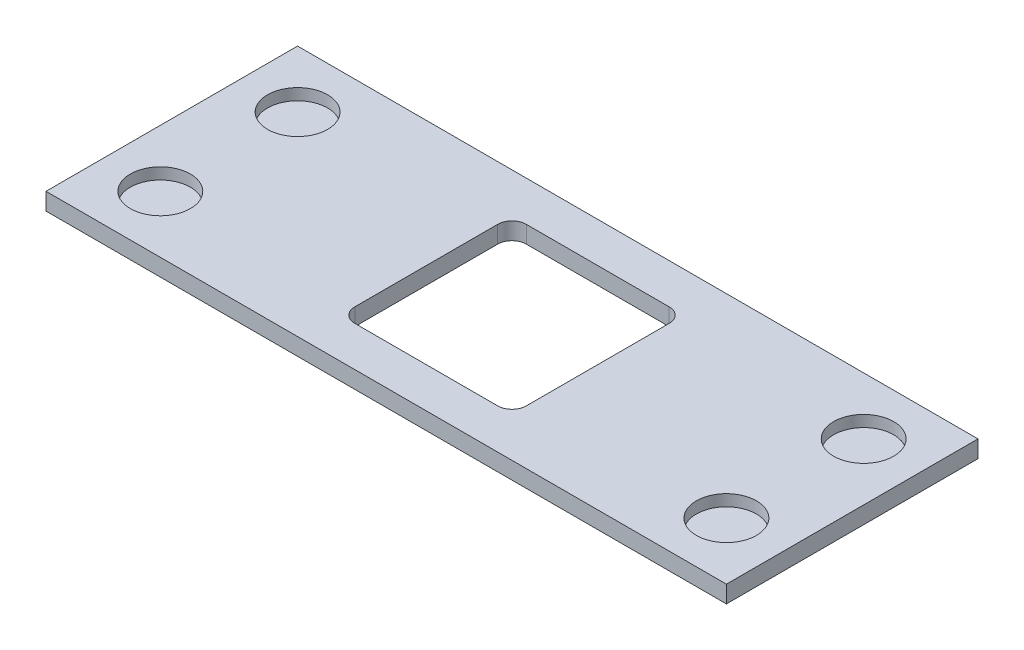
ISO-10303-21;
HEADER;
FILE_DESCRIPTION(('STEP AP214'),'2;1');
FILE_NAME('part.step','',(''),(''),'','','');
FILE_SCHEMA(('AUTOMOTIVE_DESIGN { 1 0 10303 214 1 1 1 1 }'));
ENDSEC;
DATA;
#1=APPLICATION_CONTEXT('core data for automotive mechanical design processes');
#2=APPLICATION_PROTOCOL_DEFINITION('international standard','automotive_design',2000,#1);
#3=PRODUCT_CONTEXT('',#1,'mechanical');
#4=PRODUCT('Part','Part','',(#3));
#5=PRODUCT_RELATED_PRODUCT_CATEGORY('part','',(#4));
#6=PRODUCT_DEFINITION_FORMATION('','',#4);
#7=PRODUCT_DEFINITION_CONTEXT('part definition',#1,'design');
#8=PRODUCT_DEFINITION('design','',#6,#7);
#9=PRODUCT_DEFINITION_SHAPE('','',#8);
#10=(LENGTH_UNIT() NAMED_UNIT(*) SI_UNIT(.MILLI.,.METRE.));
#11=(NAMED_UNIT(*) PLANE_ANGLE_UNIT() SI_UNIT($,.RADIAN.));
#12=(NAMED_UNIT(*) SI_UNIT($,.STERADIAN.) SOLID_ANGLE_UNIT());
#13=UNCERTAINTY_MEASURE_WITH_UNIT(LENGTH_MEASURE(1.E-05),#10,'distance_accuracy_value','');
#14=(GEOMETRIC_REPRESENTATION_CONTEXT(3) GLOBAL_UNCERTAINTY_ASSIGNED_CONTEXT((#13)) GLOBAL_UNIT_ASSIGNED_CONTEXT((#10,
#11,#12)) REPRESENTATION_CONTEXT('',''));
#15=CARTESIAN_POINT('',(0.,0.,0.));
#16=DIRECTION('',(0.,0.,1.));
#17=DIRECTION('',(1.,0.,0.));
#18=AXIS2_PLACEMENT_3D('',#15,#16,#17);
#19=CARTESIAN_POINT('',(59.5,3.,22.));
#20=DIRECTION('',(0.,1.,0.));
#21=DIRECTION('',(0.,0.,1.));
#22=AXIS2_PLACEMENT_3D('',#19,#20,#21);
#23=PLANE('',#22);
#24=CARTESIAN_POINT('',(-12.5,3.,-12.5));
#25=DIRECTION('',(0.,1.,0.));
#26=DIRECTION('',(0.,0.,1.));
#27=AXIS2_PLACEMENT_3D('',#24,#25,#26);
#28=CIRCLE('',#27,2.5);
#29=CARTESIAN_POINT('',(-12.5,3.,-15.));
#30=VERTEX_POINT('',#29);
#31=CARTESIAN_POINT('',(-15.,3.,-12.5));
#32=VERTEX_POINT('',#31);
#33=EDGE_CURVE('E49',#30,#32,#28,.T.);
#34=ORIENTED_EDGE('',*,*,#33,.F.);
#35=DIRECTION('',(-1.,0.,0.));
#36=VECTOR('',#35,1.);
#37=CARTESIAN_POINT('',(-12.5,3.,-15.));
#38=LINE('',#37,#36);
#39=CARTESIAN_POINT('',(12.5,3.,-15.));
#40=VERTEX_POINT('',#39);
#41=EDGE_CURVE('E142',#40,#30,#38,.T.);
#42=ORIENTED_EDGE('',*,*,#41,.F.);
#43=CARTESIAN_POINT('',(12.5,3.,-12.5));
#44=DIRECTION('',(0.,1.,0.));
#45=DIRECTION('',(0.,0.,-1.));
#46=AXIS2_PLACEMENT_3D('',#43,#44,#45);
#47=CIRCLE('',#46,2.5);
#48=CARTESIAN_POINT('',(15.,3.,-12.5));
#49=VERTEX_POINT('',#48);
#50=EDGE_CURVE('E145',#49,#40,#47,.T.);
#51=ORIENTED_EDGE('',*,*,#50,.F.);
#52=DIRECTION('',(0.,0.,-1.));
#53=VECTOR('',#52,1.);
#54=CARTESIAN_POINT('',(15.,3.,-12.5));
#55=LINE('',#54,#53);
#56=CARTESIAN_POINT('',(15.,3.,12.5));
#57=VERTEX_POINT('',#56);
#58=EDGE_CURVE('E173',#57,#49,#55,.T.);
#59=ORIENTED_EDGE('',*,*,#58,.F.);
#60=CARTESIAN_POINT('',(12.5,3.,12.5));
#61=DIRECTION('',(0.,1.,0.));
#62=DIRECTION('',(0.,0.,1.));
#63=AXIS2_PLACEMENT_3D('',#60,#61,#62);
#64=CIRCLE('',#63,2.5);
#65=CARTESIAN_POINT('',(12.5,3.,15.));
#66=VERTEX_POINT('',#65);
#67=EDGE_CURVE('E170',#66,#57,#64,.T.);
#68=ORIENTED_EDGE('',*,*,#67,.F.);
#69=DIRECTION('',(1.,0.,0.));
#70=VECTOR('',#69,1.);
#71=CARTESIAN_POINT('',(-12.5,3.,15.));
#72=LINE('',#71,#70);
#73=CARTESIAN_POINT('',(-12.5,3.,15.));
#74=VERTEX_POINT('',#73);
#75=EDGE_CURVE('E167',#74,#66,#72,.T.);
#76=ORIENTED_EDGE('',*,*,#75,.F.);
#77=CARTESIAN_POINT('',(-12.5,3.,12.5));
#78=DIRECTION('',(0.,1.,0.));
#79=DIRECTION('',(0.,0.,1.));
#80=AXIS2_PLACEMENT_3D('',#77,#78,#79);
#81=CIRCLE('',#80,2.5);
#82=CARTESIAN_POINT('',(-15.,3.,12.5));
#83=VERTEX_POINT('',#82);
#84=EDGE_CURVE('E164',#83,#74,#81,.T.);
#85=ORIENTED_EDGE('',*,*,#84,.F.);
#86=DIRECTION('',(0.,0.,1.));
#87=VECTOR('',#86,1.);
#88=CARTESIAN_POINT('',(-15.,3.,-12.5));
#89=LINE('',#88,#87);
#90=EDGE_CURVE('E162',#32,#83,#89,.T.);
#91=ORIENTED_EDGE('',*,*,#90,.F.);
#92=EDGE_LOOP('',(#34,#42,#51,#59,#68,#76,#85,#91));
#93=FACE_BOUND('',#92,.T.);
#94=CARTESIAN_POINT('',(49.5,3.,-12.));
#95=DIRECTION('',(0.,-1.,0.));
#96=DIRECTION('',(0.,0.,1.));
#97=AXIS2_PLACEMENT_3D('',#94,#95,#96);
#98=CIRCLE('',#97,5.25);
#99=CARTESIAN_POINT('',(49.5,3.,-6.74999999999999));
#100=VERTEX_POINT('',#99);
#101=EDGE_CURVE('E201',#100,#100,#98,.T.);
#102=ORIENTED_EDGE('',*,*,#101,.T.);
#103=EDGE_LOOP('',(#102));
#104=FACE_BOUND('',#103,.T.);
#105=CARTESIAN_POINT('',(-49.5,3.,-12.));
#106=DIRECTION('',(0.,1.,0.));
#107=DIRECTION('',(0.,0.,1.));
#108=AXIS2_PLACEMENT_3D('',#105,#106,#107);
#109=CIRCLE('',#108,5.25);
#110=CARTESIAN_POINT('',(-49.5,3.,-6.74999999999999));
#111=VERTEX_POINT('',#110);
#112=EDGE_CURVE('E207',#111,#111,#109,.T.);
#113=ORIENTED_EDGE('',*,*,#112,.F.);
#114=EDGE_LOOP('',(#113));
#115=FACE_BOUND('',#114,.T.);
#116=DIRECTION('',(0.,0.,-1.));
#117=VECTOR('',#116,1.);
#118=CARTESIAN_POINT('',(59.5,3.,-22.));
#119=LINE('',#118,#117);
#120=CARTESIAN_POINT('',(59.5,3.,22.));
#121=VERTEX_POINT('',#120);
#122=CARTESIAN_POINT('',(59.5,3.,-22.));
#123=VERTEX_POINT('',#122);
#124=EDGE_CURVE('E216',#121,#123,#119,.T.);
#125=ORIENTED_EDGE('',*,*,#124,.T.);
#126=DIRECTION('',(-1.,0.,0.));
#127=VECTOR('',#126,1.);
#128=CARTESIAN_POINT('',(-59.5,3.,-22.));
#129=LINE('',#128,#127);
#130=CARTESIAN_POINT('',(-59.5,3.,-22.));
#131=VERTEX_POINT('',#130);
#132=EDGE_CURVE('E219',#123,#131,#129,.T.);
#133=ORIENTED_EDGE('',*,*,#132,.T.);
#134=DIRECTION('',(0.,0.,1.));
#135=VECTOR('',#134,1.);
#136=CARTESIAN_POINT('',(-59.5,3.,-22.));
#137=LINE('',#136,#135);
#138=CARTESIAN_POINT('',(-59.5,3.,22.));
#139=VERTEX_POINT('',#138);
#140=EDGE_CURVE('E222',#131,#139,#137,.T.);
#141=ORIENTED_EDGE('',*,*,#140,.T.);
#142=DIRECTION('',(1.,0.,0.));
#143=VECTOR('',#142,1.);
#144=CARTESIAN_POINT('',(-59.5,3.,22.));
#145=LINE('',#144,#143);
#146=EDGE_CURVE('E224',#139,#121,#145,.T.);
#147=ORIENTED_EDGE('',*,*,#146,.T.);
#148=EDGE_LOOP('',(#125,#133,#141,#147));
#149=FACE_BOUND('',#148,.T.);
#150=CARTESIAN_POINT('',(49.5,3.,12.));
#151=DIRECTION('',(0.,1.,0.));
#152=DIRECTION('',(0.,0.,-1.));
#153=AXIS2_PLACEMENT_3D('',#150,#151,#152);
#154=CIRCLE('',#153,5.25);
#155=CARTESIAN_POINT('',(49.5,3.,6.74999999999999));
#156=VERTEX_POINT('',#155);
#157=EDGE_CURVE('E195',#156,#156,#154,.T.);
#158=ORIENTED_EDGE('',*,*,#157,.F.);
#159=EDGE_LOOP('',(#158));
#160=FACE_BOUND('',#159,.T.);
#161=CARTESIAN_POINT('',(-49.5,3.,12.));
#162=DIRECTION('',(0.,-1.,0.));
#163=DIRECTION('',(0.,0.,-1.));
#164=AXIS2_PLACEMENT_3D('',#161,#162,#163);
#165=CIRCLE('',#164,5.25);
#166=CARTESIAN_POINT('',(-49.5,3.,6.74999999999999));
#167=VERTEX_POINT('',#166);
#168=EDGE_CURVE('E180',#167,#167,#165,.T.);
#169=ORIENTED_EDGE('',*,*,#168,.T.);
#170=EDGE_LOOP('',(#169));
#171=FACE_BOUND('',#170,.T.);
#172=ADVANCED_FACE('F34',(#93,#104,#115,#149,#160,#171),#23,.T.);
#173=CARTESIAN_POINT('',(59.5,3.,-22.));
#174=DIRECTION('',(-1.,0.,0.));
#175=DIRECTION('',(0.,0.,1.));
#176=AXIS2_PLACEMENT_3D('',#173,#174,#175);
#177=PLANE('',#176);
#178=DIRECTION('',(0.,0.,-1.));
#179=VECTOR('',#178,1.);
#180=CARTESIAN_POINT('',(59.5,0.,-22.));
#181=LINE('',#180,#179);
#182=CARTESIAN_POINT('',(59.5,0.,22.));
#183=VERTEX_POINT('',#182);
#184=CARTESIAN_POINT('',(59.5,0.,-22.));
#185=VERTEX_POINT('',#184);
#186=EDGE_CURVE('E213',#183,#185,#181,.T.);
#187=ORIENTED_EDGE('',*,*,#186,.T.);
#188=DIRECTION('',(0.,-1.,0.));
#189=VECTOR('',#188,1.);
#190=CARTESIAN_POINT('',(59.5,3.,-22.));
#191=LINE('',#190,#189);
#192=EDGE_CURVE('E11',#123,#185,#191,.T.);
#193=ORIENTED_EDGE('',*,*,#192,.F.);
#194=ORIENTED_EDGE('',*,*,#124,.F.);
#195=DIRECTION('',(0.,-1.,0.));
#196=VECTOR('',#195,1.);
#197=CARTESIAN_POINT('',(59.5,3.,22.));
#198=LINE('',#197,#196);
#199=EDGE_CURVE('E226',#121,#183,#198,.T.);
#200=ORIENTED_EDGE('',*,*,#199,.T.);
#201=EDGE_LOOP('',(#187,#193,#194,#200));
#202=FACE_BOUND('',#201,.T.);
#203=ADVANCED_FACE('F36',(#202),#177,.F.);
#204=CARTESIAN_POINT('',(-59.5,3.,-22.));
#205=DIRECTION('',(0.,0.,1.));
#206=DIRECTION('',(1.,0.,0.));
#207=AXIS2_PLACEMENT_3D('',#204,#205,#206);
#208=PLANE('',#207);
#209=DIRECTION('',(-1.,0.,0.));
#210=VECTOR('',#209,1.);
#211=CARTESIAN_POINT('',(-59.5,0.,-22.));
#212=LINE('',#211,#210);
#213=CARTESIAN_POINT('',(-59.5,0.,-22.));
#214=VERTEX_POINT('',#213);
#215=EDGE_CURVE('E229',#185,#214,#212,.T.);
#216=ORIENTED_EDGE('',*,*,#215,.T.);
#217=DIRECTION('',(0.,-1.,0.));
#218=VECTOR('',#217,1.);
#219=CARTESIAN_POINT('',(-59.5,3.,-22.));
#220=LINE('',#219,#218);
#221=EDGE_CURVE('E42',#131,#214,#220,.T.);
#222=ORIENTED_EDGE('',*,*,#221,.F.);
#223=ORIENTED_EDGE('',*,*,#132,.F.);
#224=ORIENTED_EDGE('',*,*,#192,.T.);
#225=EDGE_LOOP('',(#216,#222,#223,#224));
#226=FACE_BOUND('',#225,.T.);
#227=ADVANCED_FACE('F257',(#226),#208,.F.);
#228=CARTESIAN_POINT('',(-59.5,3.,-22.));
#229=DIRECTION('',(1.,0.,0.));
#230=DIRECTION('',(0.,0.,-1.));
#231=AXIS2_PLACEMENT_3D('',#228,#229,#230);
#232=PLANE('',#231);
#233=DIRECTION('',(0.,0.,1.));
#234=VECTOR('',#233,1.);
#235=CARTESIAN_POINT('',(-59.5,0.,-22.));
#236=LINE('',#235,#234);
#237=CARTESIAN_POINT('',(-59.5,0.,22.));
#238=VERTEX_POINT('',#237);
#239=EDGE_CURVE('E231',#214,#238,#236,.T.);
#240=ORIENTED_EDGE('',*,*,#239,.T.);
#241=DIRECTION('',(0.,-1.,0.));
#242=VECTOR('',#241,1.);
#243=CARTESIAN_POINT('',(-59.5,3.,22.));
#244=LINE('',#243,#242);
#245=EDGE_CURVE('E236',#139,#238,#244,.T.);
#246=ORIENTED_EDGE('',*,*,#245,.F.);
#247=ORIENTED_EDGE('',*,*,#140,.F.);
#248=ORIENTED_EDGE('',*,*,#221,.T.);
#249=EDGE_LOOP('',(#240,#246,#247,#248));
#250=FACE_BOUND('',#249,.T.);
#251=ADVANCED_FACE('F243',(#250),#232,.F.);
#252=CARTESIAN_POINT('',(-59.5,3.,22.));
#253=DIRECTION('',(0.,0.,-1.));
#254=DIRECTION('',(-1.,0.,0.));
#255=AXIS2_PLACEMENT_3D('',#252,#253,#254);
#256=PLANE('',#255);
#257=DIRECTION('',(1.,0.,0.));
#258=VECTOR('',#257,1.);
#259=CARTESIAN_POINT('',(-59.5,0.,22.));
#260=LINE('',#259,#258);
#261=EDGE_CURVE('E220',#238,#183,#260,.T.);
#262=ORIENTED_EDGE('',*,*,#261,.T.);
#263=ORIENTED_EDGE('',*,*,#199,.F.);
#264=ORIENTED_EDGE('',*,*,#146,.F.);
#265=ORIENTED_EDGE('',*,*,#245,.T.);
#266=EDGE_LOOP('',(#262,#263,#264,#265));
#267=FACE_BOUND('',#266,.T.);
#268=ADVANCED_FACE('F250',(#267),#256,.F.);
#269=CARTESIAN_POINT('',(59.5,0.,22.));
#270=DIRECTION('',(0.,1.,0.));
#271=DIRECTION('',(0.,0.,1.));
#272=AXIS2_PLACEMENT_3D('',#269,#270,#271);
#273=PLANE('',#272);
#274=DIRECTION('',(-1.,0.,0.));
#275=VECTOR('',#274,1.);
#276=CARTESIAN_POINT('',(-12.5,0.,-15.));
#277=LINE('',#276,#275);
#278=CARTESIAN_POINT('',(12.5,0.,-15.));
#279=VERTEX_POINT('',#278);
#280=CARTESIAN_POINT('',(-12.5,0.,-15.));
#281=VERTEX_POINT('',#280);
#282=EDGE_CURVE('E131',#279,#281,#277,.T.);
#283=ORIENTED_EDGE('',*,*,#282,.T.);
#284=CARTESIAN_POINT('',(-12.5,0.,-12.5));
#285=DIRECTION('',(0.,1.,0.));
#286=DIRECTION('',(0.,0.,1.));
#287=AXIS2_PLACEMENT_3D('',#284,#285,#286);
#288=CIRCLE('',#287,2.5);
#289=CARTESIAN_POINT('',(-15.,0.,-12.5));
#290=VERTEX_POINT('',#289);
#291=EDGE_CURVE('E125',#281,#290,#288,.T.);
#292=ORIENTED_EDGE('',*,*,#291,.T.);
#293=DIRECTION('',(0.,0.,1.));
#294=VECTOR('',#293,1.);
#295=CARTESIAN_POINT('',(-15.,0.,-12.5));
#296=LINE('',#295,#294);
#297=CARTESIAN_POINT('',(-15.,0.,12.5));
#298=VERTEX_POINT('',#297);
#299=EDGE_CURVE('E134',#290,#298,#296,.T.);
#300=ORIENTED_EDGE('',*,*,#299,.T.);
#301=CARTESIAN_POINT('',(-12.5,0.,12.5));
#302=DIRECTION('',(0.,1.,0.));
#303=DIRECTION('',(0.,0.,1.));
#304=AXIS2_PLACEMENT_3D('',#301,#302,#303);
#305=CIRCLE('',#304,2.5);
#306=CARTESIAN_POINT('',(-12.5,0.,15.));
#307=VERTEX_POINT('',#306);
#308=EDGE_CURVE('E57',#298,#307,#305,.T.);
#309=ORIENTED_EDGE('',*,*,#308,.T.);
#310=DIRECTION('',(1.,0.,0.));
#311=VECTOR('',#310,1.);
#312=CARTESIAN_POINT('',(-12.5,0.,15.));
#313=LINE('',#312,#311);
#314=CARTESIAN_POINT('',(12.5,0.,15.));
#315=VERTEX_POINT('',#314);
#316=EDGE_CURVE('E149',#307,#315,#313,.T.);
#317=ORIENTED_EDGE('',*,*,#316,.T.);
#318=CARTESIAN_POINT('',(12.5,0.,12.5));
#319=DIRECTION('',(0.,1.,0.));
#320=DIRECTION('',(0.,0.,1.));
#321=AXIS2_PLACEMENT_3D('',#318,#319,#320);
#322=CIRCLE('',#321,2.5);
#323=CARTESIAN_POINT('',(15.,0.,12.5));
#324=VERTEX_POINT('',#323);
#325=EDGE_CURVE('E152',#315,#324,#322,.T.);
#326=ORIENTED_EDGE('',*,*,#325,.T.);
#327=DIRECTION('',(0.,0.,-1.));
#328=VECTOR('',#327,1.);
#329=CARTESIAN_POINT('',(15.,0.,-12.5));
#330=LINE('',#329,#328);
#331=CARTESIAN_POINT('',(15.,0.,-12.5));
#332=VERTEX_POINT('',#331);
#333=EDGE_CURVE('E155',#324,#332,#330,.T.);
#334=ORIENTED_EDGE('',*,*,#333,.T.);
#335=CARTESIAN_POINT('',(12.5,0.,-12.5));
#336=DIRECTION('',(0.,1.,0.));
#337=DIRECTION('',(0.,0.,-1.));
#338=AXIS2_PLACEMENT_3D('',#335,#336,#337);
#339=CIRCLE('',#338,2.5);
#340=EDGE_CURVE('E158',#332,#279,#339,.T.);
#341=ORIENTED_EDGE('',*,*,#340,.T.);
#342=EDGE_LOOP('',(#283,#292,#300,#309,#317,#326,#334,#341));
#343=FACE_BOUND('',#342,.T.);
#344=ORIENTED_EDGE('',*,*,#186,.F.);
#345=ORIENTED_EDGE('',*,*,#261,.F.);
#346=ORIENTED_EDGE('',*,*,#239,.F.);
#347=ORIENTED_EDGE('',*,*,#215,.F.);
#348=EDGE_LOOP('',(#344,#345,#346,#347));
#349=FACE_BOUND('',#348,.T.);
#350=ADVANCED_FACE('F138',(#343,#349),#273,.F.);
#351=CARTESIAN_POINT('',(-49.5,1.,-12.));
#352=DIRECTION('',(0.,1.,0.));
#353=DIRECTION('',(0.,0.,1.));
#354=AXIS2_PLACEMENT_3D('',#351,#352,#353);
#355=CYLINDRICAL_SURFACE('',#354,5.25);
#356=CARTESIAN_POINT('',(-49.5,1.,-12.));
#357=DIRECTION('',(0.,1.,0.));
#358=DIRECTION('',(0.,0.,1.));
#359=AXIS2_PLACEMENT_3D('',#356,#357,#358);
#360=CIRCLE('',#359,5.25);
#361=CARTESIAN_POINT('',(-49.5,1.,-6.74999999999999));
#362=VERTEX_POINT('',#361);
#363=EDGE_CURVE('E210',#362,#362,#360,.T.);
#364=ORIENTED_EDGE('',*,*,#363,.F.);
#365=EDGE_LOOP('',(#364));
#366=FACE_BOUND('',#365,.T.);
#367=ORIENTED_EDGE('',*,*,#112,.T.);
#368=EDGE_LOOP('',(#367));
#369=FACE_BOUND('',#368,.T.);
#370=ADVANCED_FACE('F272',(#366,#369),#355,.F.);
#371=CARTESIAN_POINT('',(-49.5,1.,-12.));
#372=DIRECTION('',(0.,1.,0.));
#373=DIRECTION('',(0.,0.,1.));
#374=AXIS2_PLACEMENT_3D('',#371,#372,#373);
#375=PLANE('',#374);
#376=ORIENTED_EDGE('',*,*,#363,.T.);
#377=EDGE_LOOP('',(#376));
#378=FACE_BOUND('',#377,.T.);
#379=ADVANCED_FACE('F292',(#378),#375,.T.);
#380=CARTESIAN_POINT('',(49.5,1.,-12.));
#381=DIRECTION('',(0.,1.,0.));
#382=DIRECTION('',(0.,0.,1.));
#383=AXIS2_PLACEMENT_3D('',#380,#381,#382);
#384=CYLINDRICAL_SURFACE('',#383,5.25);
#385=CARTESIAN_POINT('',(49.5,1.,-12.));
#386=DIRECTION('',(0.,-1.,0.));
#387=DIRECTION('',(0.,0.,1.));
#388=AXIS2_PLACEMENT_3D('',#385,#386,#387);
#389=CIRCLE('',#388,5.25);
#390=CARTESIAN_POINT('',(49.5,1.,-6.74999999999999));
#391=VERTEX_POINT('',#390);
#392=EDGE_CURVE('E204',#391,#391,#389,.T.);
#393=ORIENTED_EDGE('',*,*,#392,.T.);
#394=EDGE_LOOP('',(#393));
#395=FACE_BOUND('',#394,.T.);
#396=ORIENTED_EDGE('',*,*,#101,.F.);
#397=EDGE_LOOP('',(#396));
#398=FACE_BOUND('',#397,.T.);
#399=ADVANCED_FACE('F299',(#395,#398),#384,.F.);
#400=CARTESIAN_POINT('',(49.5,1.,-12.));
#401=DIRECTION('',(0.,1.,0.));
#402=DIRECTION('',(0.,0.,1.));
#403=AXIS2_PLACEMENT_3D('',#400,#401,#402);
#404=PLANE('',#403);
#405=ORIENTED_EDGE('',*,*,#392,.F.);
#406=EDGE_LOOP('',(#405));
#407=FACE_BOUND('',#406,.T.);
#408=ADVANCED_FACE('F306',(#407),#404,.T.);
#409=CARTESIAN_POINT('',(49.5,1.,12.));
#410=DIRECTION('',(0.,1.,0.));
#411=DIRECTION('',(0.,0.,1.));
#412=AXIS2_PLACEMENT_3D('',#409,#410,#411);
#413=CYLINDRICAL_SURFACE('',#412,5.25);
#414=CARTESIAN_POINT('',(49.5,1.,12.));
#415=DIRECTION('',(0.,1.,0.));
#416=DIRECTION('',(0.,0.,-1.));
#417=AXIS2_PLACEMENT_3D('',#414,#415,#416);
#418=CIRCLE('',#417,5.25);
#419=CARTESIAN_POINT('',(49.5,1.,6.74999999999999));
#420=VERTEX_POINT('',#419);
#421=EDGE_CURVE('E198',#420,#420,#418,.T.);
#422=ORIENTED_EDGE('',*,*,#421,.F.);
#423=EDGE_LOOP('',(#422));
#424=FACE_BOUND('',#423,.T.);
#425=ORIENTED_EDGE('',*,*,#157,.T.);
#426=EDGE_LOOP('',(#425));
#427=FACE_BOUND('',#426,.T.);
#428=ADVANCED_FACE('F314',(#424,#427),#413,.F.);
#429=CARTESIAN_POINT('',(49.5,1.,12.));
#430=DIRECTION('',(0.,1.,0.));
#431=DIRECTION('',(0.,0.,-1.));
#432=AXIS2_PLACEMENT_3D('',#429,#430,#431);
#433=PLANE('',#432);
#434=ORIENTED_EDGE('',*,*,#421,.T.);
#435=EDGE_LOOP('',(#434));
#436=FACE_BOUND('',#435,.T.);
#437=ADVANCED_FACE('F322',(#436),#433,.T.);
#438=CARTESIAN_POINT('',(-49.5,1.,12.));
#439=DIRECTION('',(0.,1.,0.));
#440=DIRECTION('',(0.,0.,1.));
#441=AXIS2_PLACEMENT_3D('',#438,#439,#440);
#442=CYLINDRICAL_SURFACE('',#441,5.25);
#443=CARTESIAN_POINT('',(-49.5,1.,12.));
#444=DIRECTION('',(0.,-1.,0.));
#445=DIRECTION('',(0.,0.,-1.));
#446=AXIS2_PLACEMENT_3D('',#443,#444,#445);
#447=CIRCLE('',#446,5.25);
#448=CARTESIAN_POINT('',(-49.5,1.,6.74999999999999));
#449=VERTEX_POINT('',#448);
#450=EDGE_CURVE('E192',#449,#449,#447,.T.);
#451=ORIENTED_EDGE('',*,*,#450,.T.);
#452=EDGE_LOOP('',(#451));
#453=FACE_BOUND('',#452,.T.);
#454=ORIENTED_EDGE('',*,*,#168,.F.);
#455=EDGE_LOOP('',(#454));
#456=FACE_BOUND('',#455,.T.);
#457=ADVANCED_FACE('F330',(#453,#456),#442,.F.);
#458=CARTESIAN_POINT('',(-49.5,1.,12.));
#459=DIRECTION('',(0.,1.,0.));
#460=DIRECTION('',(0.,0.,-1.));
#461=AXIS2_PLACEMENT_3D('',#458,#459,#460);
#462=PLANE('',#461);
#463=ORIENTED_EDGE('',*,*,#450,.F.);
#464=EDGE_LOOP('',(#463));
#465=FACE_BOUND('',#464,.T.);
#466=ADVANCED_FACE('F338',(#465),#462,.T.);
#467=CARTESIAN_POINT('',(-12.5,0.,-12.5));
#468=DIRECTION('',(0.,1.,0.));
#469=DIRECTION('',(0.,0.,1.));
#470=AXIS2_PLACEMENT_3D('',#467,#468,#469);
#471=CYLINDRICAL_SURFACE('',#470,2.5);
#472=ORIENTED_EDGE('',*,*,#33,.T.);
#473=DIRECTION('',(0.,1.,0.));
#474=VECTOR('',#473,1.);
#475=CARTESIAN_POINT('',(-15.,0.,-12.5));
#476=LINE('',#475,#474);
#477=EDGE_CURVE('E121',#290,#32,#476,.T.);
#478=ORIENTED_EDGE('',*,*,#477,.F.);
#479=ORIENTED_EDGE('',*,*,#291,.F.);
#480=DIRECTION('',(0.,1.,0.));
#481=VECTOR('',#480,1.);
#482=CARTESIAN_POINT('',(-12.5,0.,-15.));
#483=LINE('',#482,#481);
#484=EDGE_CURVE('E178',#281,#30,#483,.T.);
#485=ORIENTED_EDGE('',*,*,#484,.T.);
#486=EDGE_LOOP('',(#472,#478,#479,#485));
#487=FACE_BOUND('',#486,.T.);
#488=ADVANCED_FACE('F123',(#487),#471,.F.);
#489=CARTESIAN_POINT('',(-12.5,0.,-15.));
#490=DIRECTION('',(0.,0.,-1.));
#491=DIRECTION('',(-1.,0.,0.));
#492=AXIS2_PLACEMENT_3D('',#489,#490,#491);
#493=PLANE('',#492);
#494=ORIENTED_EDGE('',*,*,#41,.T.);
#495=ORIENTED_EDGE('',*,*,#484,.F.);
#496=ORIENTED_EDGE('',*,*,#282,.F.);
#497=DIRECTION('',(0.,1.,0.));
#498=VECTOR('',#497,1.);
#499=CARTESIAN_POINT('',(12.5,0.,-15.));
#500=LINE('',#499,#498);
#501=EDGE_CURVE('E181',#279,#40,#500,.T.);
#502=ORIENTED_EDGE('',*,*,#501,.T.);
#503=EDGE_LOOP('',(#494,#495,#496,#502));
#504=FACE_BOUND('',#503,.T.);
#505=ADVANCED_FACE('F352',(#504),#493,.F.);
#506=CARTESIAN_POINT('',(12.5,0.,-12.5));
#507=DIRECTION('',(0.,1.,0.));
#508=DIRECTION('',(0.,0.,1.));
#509=AXIS2_PLACEMENT_3D('',#506,#507,#508);
#510=CYLINDRICAL_SURFACE('',#509,2.5);
#511=ORIENTED_EDGE('',*,*,#50,.T.);
#512=ORIENTED_EDGE('',*,*,#501,.F.);
#513=ORIENTED_EDGE('',*,*,#340,.F.);
#514=DIRECTION('',(0.,1.,0.));
#515=VECTOR('',#514,1.);
#516=CARTESIAN_POINT('',(15.,0.,-12.5));
#517=LINE('',#516,#515);
#518=EDGE_CURVE('E183',#332,#49,#517,.T.);
#519=ORIENTED_EDGE('',*,*,#518,.T.);
#520=EDGE_LOOP('',(#511,#512,#513,#519));
#521=FACE_BOUND('',#520,.T.);
#522=ADVANCED_FACE('F359',(#521),#510,.F.);
#523=CARTESIAN_POINT('',(15.,0.,-12.5));
#524=DIRECTION('',(1.,0.,0.));
#525=DIRECTION('',(0.,0.,-1.));
#526=AXIS2_PLACEMENT_3D('',#523,#524,#525);
#527=PLANE('',#526);
#528=ORIENTED_EDGE('',*,*,#58,.T.);
#529=ORIENTED_EDGE('',*,*,#518,.F.);
#530=ORIENTED_EDGE('',*,*,#333,.F.);
#531=DIRECTION('',(0.,1.,0.));
#532=VECTOR('',#531,1.);
#533=CARTESIAN_POINT('',(15.,0.,12.5));
#534=LINE('',#533,#532);
#535=EDGE_CURVE('E185',#324,#57,#534,.T.);
#536=ORIENTED_EDGE('',*,*,#535,.T.);
#537=EDGE_LOOP('',(#528,#529,#530,#536));
#538=FACE_BOUND('',#537,.T.);
#539=ADVANCED_FACE('F367',(#538),#527,.F.);
#540=CARTESIAN_POINT('',(12.5,0.,12.5));
#541=DIRECTION('',(0.,1.,0.));
#542=DIRECTION('',(0.,0.,1.));
#543=AXIS2_PLACEMENT_3D('',#540,#541,#542);
#544=CYLINDRICAL_SURFACE('',#543,2.5);
#545=ORIENTED_EDGE('',*,*,#67,.T.);
#546=ORIENTED_EDGE('',*,*,#535,.F.);
#547=ORIENTED_EDGE('',*,*,#325,.F.);
#548=DIRECTION('',(0.,1.,0.));
#549=VECTOR('',#548,1.);
#550=CARTESIAN_POINT('',(12.5,0.,15.));
#551=LINE('',#550,#549);
#552=EDGE_CURVE('E187',#315,#66,#551,.T.);
#553=ORIENTED_EDGE('',*,*,#552,.T.);
#554=EDGE_LOOP('',(#545,#546,#547,#553));
#555=FACE_BOUND('',#554,.T.);
#556=ADVANCED_FACE('F375',(#555),#544,.F.);
#557=CARTESIAN_POINT('',(-12.5,0.,15.));
#558=DIRECTION('',(0.,0.,1.));
#559=DIRECTION('',(1.,0.,0.));
#560=AXIS2_PLACEMENT_3D('',#557,#558,#559);
#561=PLANE('',#560);
#562=ORIENTED_EDGE('',*,*,#75,.T.);
#563=ORIENTED_EDGE('',*,*,#552,.F.);
#564=ORIENTED_EDGE('',*,*,#316,.F.);
#565=DIRECTION('',(0.,1.,0.));
#566=VECTOR('',#565,1.);
#567=CARTESIAN_POINT('',(-12.5,0.,15.));
#568=LINE('',#567,#566);
#569=EDGE_CURVE('E189',#307,#74,#568,.T.);
#570=ORIENTED_EDGE('',*,*,#569,.T.);
#571=EDGE_LOOP('',(#562,#563,#564,#570));
#572=FACE_BOUND('',#571,.T.);
#573=ADVANCED_FACE('F383',(#572),#561,.F.);
#574=CARTESIAN_POINT('',(-12.5,0.,12.5));
#575=DIRECTION('',(0.,1.,0.));
#576=DIRECTION('',(0.,0.,1.));
#577=AXIS2_PLACEMENT_3D('',#574,#575,#576);
#578=CYLINDRICAL_SURFACE('',#577,2.5);
#579=ORIENTED_EDGE('',*,*,#84,.T.);
#580=ORIENTED_EDGE('',*,*,#569,.F.);
#581=ORIENTED_EDGE('',*,*,#308,.F.);
#582=DIRECTION('',(0.,1.,0.));
#583=VECTOR('',#582,1.);
#584=CARTESIAN_POINT('',(-15.,0.,12.5));
#585=LINE('',#584,#583);
#586=EDGE_CURVE('E130',#298,#83,#585,.T.);
#587=ORIENTED_EDGE('',*,*,#586,.T.);
#588=EDGE_LOOP('',(#579,#580,#581,#587));
#589=FACE_BOUND('',#588,.T.);
#590=ADVANCED_FACE('F391',(#589),#578,.F.);
#591=CARTESIAN_POINT('',(-15.,0.,-12.5));
#592=DIRECTION('',(-1.,0.,0.));
#593=DIRECTION('',(0.,0.,1.));
#594=AXIS2_PLACEMENT_3D('',#591,#592,#593);
#595=PLANE('',#594);
#596=ORIENTED_EDGE('',*,*,#90,.T.);
#597=ORIENTED_EDGE('',*,*,#586,.F.);
#598=ORIENTED_EDGE('',*,*,#299,.F.);
#599=ORIENTED_EDGE('',*,*,#477,.T.);
#600=EDGE_LOOP('',(#596,#597,#598,#599));
#601=FACE_BOUND('',#600,.T.);
#602=ADVANCED_FACE('F135',(#601),#595,.F.);
#603=CLOSED_SHELL('',(#172,#203,#227,#251,#268,#350,#370,#379,#399,#408,#428,#437,#457,#466,
#488,#505,#522,#539,#556,#573,#590,#602));
#604=MANIFOLD_SOLID_BREP('B2',#603);
#605=ADVANCED_BREP_SHAPE_REPRESENTATION('',(#18,#604),#14);
#606=SHAPE_DEFINITION_REPRESENTATION(#9,#605);
ENDSEC;
END-ISO-10303-21;
